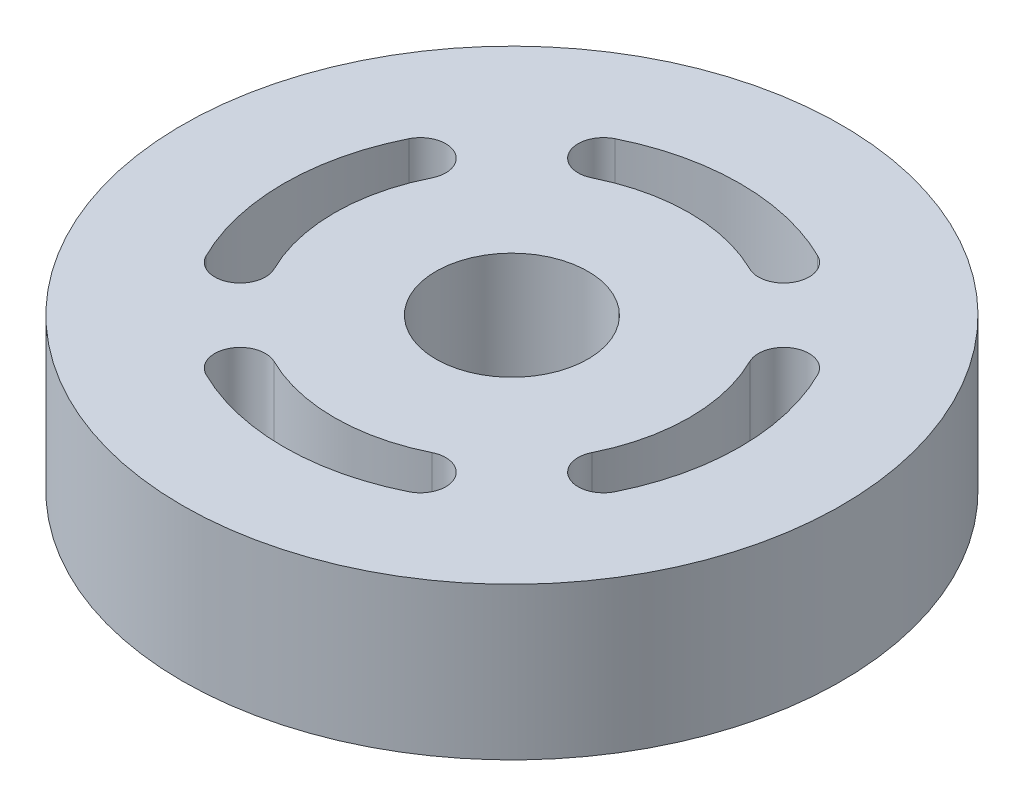
ISO-10303-21;
HEADER;
FILE_DESCRIPTION(('STEP AP214'),'2;1');
FILE_NAME('part.step','',(''),(''),'','','');
FILE_SCHEMA(('AUTOMOTIVE_DESIGN { 1 0 10303 214 1 1 1 1 }'));
ENDSEC;
DATA;
#1=APPLICATION_CONTEXT('core data for automotive mechanical design processes');
#2=APPLICATION_PROTOCOL_DEFINITION('international standard','automotive_design',2000,#1);
#3=PRODUCT_CONTEXT('',#1,'mechanical');
#4=PRODUCT('Part','Part','',(#3));
#5=PRODUCT_RELATED_PRODUCT_CATEGORY('part','',(#4));
#6=PRODUCT_DEFINITION_FORMATION('','',#4);
#7=PRODUCT_DEFINITION_CONTEXT('part definition',#1,'design');
#8=PRODUCT_DEFINITION('design','',#6,#7);
#9=PRODUCT_DEFINITION_SHAPE('','',#8);
#10=(LENGTH_UNIT() NAMED_UNIT(*) SI_UNIT(.MILLI.,.METRE.));
#11=(NAMED_UNIT(*) PLANE_ANGLE_UNIT() SI_UNIT($,.RADIAN.));
#12=(NAMED_UNIT(*) SI_UNIT($,.STERADIAN.) SOLID_ANGLE_UNIT());
#13=UNCERTAINTY_MEASURE_WITH_UNIT(LENGTH_MEASURE(1.E-05),#10,'distance_accuracy_value','');
#14=(GEOMETRIC_REPRESENTATION_CONTEXT(3) GLOBAL_UNCERTAINTY_ASSIGNED_CONTEXT((#13)) GLOBAL_UNIT_ASSIGNED_CONTEXT((#10,
#11,#12)) REPRESENTATION_CONTEXT('',''));
#15=CARTESIAN_POINT('',(0.,0.,0.));
#16=DIRECTION('',(0.,0.,1.));
#17=DIRECTION('',(1.,0.,0.));
#18=AXIS2_PLACEMENT_3D('',#15,#16,#17);
#19=CARTESIAN_POINT('',(7.1664513318209,6.,-3.55555555555563));
#20=DIRECTION('',(0.,-1.,0.));
#21=DIRECTION('',(1.,0.,0.));
#22=AXIS2_PLACEMENT_3D('',#19,#20,#21);
#23=CYLINDRICAL_SURFACE('',#22,1.);
#24=CARTESIAN_POINT('',(7.1664513318209,0.,-3.55555555555563));
#25=DIRECTION('',(0.,1.,0.));
#26=DIRECTION('',(1.,0.,0.));
#27=AXIS2_PLACEMENT_3D('',#24,#25,#26);
#28=CIRCLE('',#27,1.);
#29=CARTESIAN_POINT('',(8.06225774829851,0.,-4.00000000000008));
#30=VERTEX_POINT('',#29);
#31=CARTESIAN_POINT('',(6.27064491534328,0.,-3.11111111111118));
#32=VERTEX_POINT('',#31);
#33=EDGE_CURVE('E40',#30,#32,#28,.T.);
#34=ORIENTED_EDGE('',*,*,#33,.F.);
#35=DIRECTION('',(0.,-1.,0.));
#36=VECTOR('',#35,1.);
#37=CARTESIAN_POINT('',(8.06225774829851,6.,-4.00000000000008));
#38=LINE('',#37,#36);
#39=CARTESIAN_POINT('',(8.06225774829851,6.,-4.00000000000008));
#40=VERTEX_POINT('',#39);
#41=EDGE_CURVE('E269',#40,#30,#38,.T.);
#42=ORIENTED_EDGE('',*,*,#41,.F.);
#43=CARTESIAN_POINT('',(7.1664513318209,6.,-3.55555555555563));
#44=DIRECTION('',(0.,1.,0.));
#45=DIRECTION('',(1.,0.,0.));
#46=AXIS2_PLACEMENT_3D('',#43,#44,#45);
#47=CIRCLE('',#46,1.);
#48=CARTESIAN_POINT('',(6.27064491534328,6.,-3.11111111111118));
#49=VERTEX_POINT('',#48);
#50=EDGE_CURVE('E11',#40,#49,#47,.T.);
#51=ORIENTED_EDGE('',*,*,#50,.T.);
#52=DIRECTION('',(0.,-1.,0.));
#53=VECTOR('',#52,1.);
#54=CARTESIAN_POINT('',(6.27064491534328,6.,-3.11111111111118));
#55=LINE('',#54,#53);
#56=EDGE_CURVE('E273',#49,#32,#55,.T.);
#57=ORIENTED_EDGE('',*,*,#56,.T.);
#58=EDGE_LOOP('',(#34,#42,#51,#57));
#59=FACE_BOUND('',#58,.T.);
#60=ADVANCED_FACE('F33',(#59),#23,.F.);
#61=CARTESIAN_POINT('',(7.16645133182097,6.,3.55555555555548));
#62=DIRECTION('',(0.,-1.,0.));
#63=DIRECTION('',(1.,0.,0.));
#64=AXIS2_PLACEMENT_3D('',#61,#62,#63);
#65=CYLINDRICAL_SURFACE('',#64,1.);
#66=CARTESIAN_POINT('',(7.16645133182097,0.,3.55555555555548));
#67=DIRECTION('',(0.,1.,0.));
#68=DIRECTION('',(-1.,0.,0.));
#69=AXIS2_PLACEMENT_3D('',#66,#67,#68);
#70=CIRCLE('',#69,1.);
#71=CARTESIAN_POINT('',(6.27064491534335,0.,3.11111111111105));
#72=VERTEX_POINT('',#71);
#73=CARTESIAN_POINT('',(8.06225774829859,0.,3.99999999999992));
#74=VERTEX_POINT('',#73);
#75=EDGE_CURVE('E279',#72,#74,#70,.T.);
#76=ORIENTED_EDGE('',*,*,#75,.F.);
#77=DIRECTION('',(0.,-1.,0.));
#78=VECTOR('',#77,1.);
#79=CARTESIAN_POINT('',(6.27064491534335,6.,3.11111111111105));
#80=LINE('',#79,#78);
#81=CARTESIAN_POINT('',(6.27064491534335,6.,3.11111111111105));
#82=VERTEX_POINT('',#81);
#83=EDGE_CURVE('E277',#82,#72,#80,.T.);
#84=ORIENTED_EDGE('',*,*,#83,.F.);
#85=CARTESIAN_POINT('',(7.16645133182097,6.,3.55555555555548));
#86=DIRECTION('',(0.,1.,0.));
#87=DIRECTION('',(-1.,0.,0.));
#88=AXIS2_PLACEMENT_3D('',#85,#86,#87);
#89=CIRCLE('',#88,1.);
#90=CARTESIAN_POINT('',(8.06225774829859,6.,3.99999999999992));
#91=VERTEX_POINT('',#90);
#92=EDGE_CURVE('E281',#82,#91,#89,.T.);
#93=ORIENTED_EDGE('',*,*,#92,.T.);
#94=DIRECTION('',(0.,-1.,0.));
#95=VECTOR('',#94,1.);
#96=CARTESIAN_POINT('',(8.06225774829859,6.,3.99999999999992));
#97=LINE('',#96,#95);
#98=EDGE_CURVE('E264',#91,#74,#97,.T.);
#99=ORIENTED_EDGE('',*,*,#98,.T.);
#100=EDGE_LOOP('',(#76,#84,#93,#99));
#101=FACE_BOUND('',#100,.T.);
#102=ADVANCED_FACE('F296',(#101),#65,.F.);
#103=CARTESIAN_POINT('',(0.,6.,0.));
#104=DIRECTION('',(0.,-1.,0.));
#105=DIRECTION('',(1.,0.,0.));
#106=AXIS2_PLACEMENT_3D('',#103,#104,#105);
#107=CYLINDRICAL_SURFACE('',#106,7.);
#108=CARTESIAN_POINT('',(0.,0.,0.));
#109=DIRECTION('',(0.,-1.,0.));
#110=DIRECTION('',(-1.,0.,0.));
#111=AXIS2_PLACEMENT_3D('',#108,#109,#110);
#112=CIRCLE('',#111,7.);
#113=EDGE_CURVE('E47',#32,#72,#112,.T.);
#114=ORIENTED_EDGE('',*,*,#113,.F.);
#115=ORIENTED_EDGE('',*,*,#56,.F.);
#116=CARTESIAN_POINT('',(0.,6.,0.));
#117=DIRECTION('',(0.,-1.,0.));
#118=DIRECTION('',(1.,0.,0.));
#119=AXIS2_PLACEMENT_3D('',#116,#117,#118);
#120=CIRCLE('',#119,7.);
#121=EDGE_CURVE('E54',#49,#82,#120,.T.);
#122=ORIENTED_EDGE('',*,*,#121,.T.);
#123=ORIENTED_EDGE('',*,*,#83,.T.);
#124=EDGE_LOOP('',(#114,#115,#122,#123));
#125=FACE_BOUND('',#124,.T.);
#126=ADVANCED_FACE('F289',(#125),#107,.T.);
#127=CARTESIAN_POINT('',(0.,6.,0.));
#128=DIRECTION('',(0.,-1.,0.));
#129=DIRECTION('',(1.,0.,0.));
#130=AXIS2_PLACEMENT_3D('',#127,#128,#129);
#131=CYLINDRICAL_SURFACE('',#130,9.);
#132=CARTESIAN_POINT('',(0.,0.,0.));
#133=DIRECTION('',(0.,1.,0.));
#134=DIRECTION('',(1.,0.,0.));
#135=AXIS2_PLACEMENT_3D('',#132,#133,#134);
#136=CIRCLE('',#135,9.);
#137=EDGE_CURVE('E262',#74,#30,#136,.T.);
#138=ORIENTED_EDGE('',*,*,#137,.F.);
#139=ORIENTED_EDGE('',*,*,#98,.F.);
#140=CARTESIAN_POINT('',(0.,6.,0.));
#141=DIRECTION('',(0.,1.,0.));
#142=DIRECTION('',(-1.,0.,0.));
#143=AXIS2_PLACEMENT_3D('',#140,#141,#142);
#144=CIRCLE('',#143,9.);
#145=EDGE_CURVE('E267',#91,#40,#144,.T.);
#146=ORIENTED_EDGE('',*,*,#145,.T.);
#147=ORIENTED_EDGE('',*,*,#41,.T.);
#148=EDGE_LOOP('',(#138,#139,#146,#147));
#149=FACE_BOUND('',#148,.T.);
#150=ADVANCED_FACE('F298',(#149),#131,.F.);
#151=CARTESIAN_POINT('',(3.55555555555556,6.,7.16645133182093));
#152=DIRECTION('',(0.,-1.,0.));
#153=DIRECTION('',(0.,0.,1.));
#154=AXIS2_PLACEMENT_3D('',#151,#152,#153);
#155=CYLINDRICAL_SURFACE('',#154,1.);
#156=CARTESIAN_POINT('',(3.55555555555556,0.,7.16645133182093));
#157=DIRECTION('',(0.,1.,0.));
#158=DIRECTION('',(0.,0.,1.));
#159=AXIS2_PLACEMENT_3D('',#156,#157,#158);
#160=CIRCLE('',#159,1.);
#161=CARTESIAN_POINT('',(4.,0.,8.06225774829855));
#162=VERTEX_POINT('',#161);
#163=CARTESIAN_POINT('',(3.11111111111112,0.,6.27064491534332));
#164=VERTEX_POINT('',#163);
#165=EDGE_CURVE('E256',#162,#164,#160,.T.);
#166=ORIENTED_EDGE('',*,*,#165,.F.);
#167=DIRECTION('',(0.,-1.,0.));
#168=VECTOR('',#167,1.);
#169=CARTESIAN_POINT('',(4.,6.,8.06225774829855));
#170=LINE('',#169,#168);
#171=CARTESIAN_POINT('',(4.,6.,8.06225774829855));
#172=VERTEX_POINT('',#171);
#173=EDGE_CURVE('E237',#172,#162,#170,.T.);
#174=ORIENTED_EDGE('',*,*,#173,.F.);
#175=CARTESIAN_POINT('',(3.55555555555556,6.,7.16645133182093));
#176=DIRECTION('',(0.,1.,0.));
#177=DIRECTION('',(0.,0.,1.));
#178=AXIS2_PLACEMENT_3D('',#175,#176,#177);
#179=CIRCLE('',#178,1.);
#180=CARTESIAN_POINT('',(3.11111111111112,6.,6.27064491534332));
#181=VERTEX_POINT('',#180);
#182=EDGE_CURVE('E259',#172,#181,#179,.T.);
#183=ORIENTED_EDGE('',*,*,#182,.T.);
#184=DIRECTION('',(0.,-1.,0.));
#185=VECTOR('',#184,1.);
#186=CARTESIAN_POINT('',(3.11111111111112,6.,6.27064491534332));
#187=LINE('',#186,#185);
#188=EDGE_CURVE('E242',#181,#164,#187,.T.);
#189=ORIENTED_EDGE('',*,*,#188,.T.);
#190=EDGE_LOOP('',(#166,#174,#183,#189));
#191=FACE_BOUND('',#190,.T.);
#192=ADVANCED_FACE('F300',(#191),#155,.F.);
#193=CARTESIAN_POINT('',(-3.55555555555556,6.,7.16645133182093));
#194=DIRECTION('',(0.,-1.,0.));
#195=DIRECTION('',(0.,0.,1.));
#196=AXIS2_PLACEMENT_3D('',#193,#194,#195);
#197=CYLINDRICAL_SURFACE('',#196,1.);
#198=CARTESIAN_POINT('',(-3.55555555555556,0.,7.16645133182093));
#199=DIRECTION('',(0.,1.,0.));
#200=DIRECTION('',(0.,0.,-1.));
#201=AXIS2_PLACEMENT_3D('',#198,#199,#200);
#202=CIRCLE('',#201,1.);
#203=CARTESIAN_POINT('',(-3.11111111111111,0.,6.27064491534332));
#204=VERTEX_POINT('',#203);
#205=CARTESIAN_POINT('',(-4.,0.,8.06225774829855));
#206=VERTEX_POINT('',#205);
#207=EDGE_CURVE('E250',#204,#206,#202,.T.);
#208=ORIENTED_EDGE('',*,*,#207,.F.);
#209=DIRECTION('',(0.,-1.,0.));
#210=VECTOR('',#209,1.);
#211=CARTESIAN_POINT('',(-3.11111111111111,6.,6.27064491534332));
#212=LINE('',#211,#210);
#213=CARTESIAN_POINT('',(-3.11111111111111,6.,6.27064491534332));
#214=VERTEX_POINT('',#213);
#215=EDGE_CURVE('E247',#214,#204,#212,.T.);
#216=ORIENTED_EDGE('',*,*,#215,.F.);
#217=CARTESIAN_POINT('',(-3.55555555555556,6.,7.16645133182093));
#218=DIRECTION('',(0.,1.,0.));
#219=DIRECTION('',(0.,0.,-1.));
#220=AXIS2_PLACEMENT_3D('',#217,#218,#219);
#221=CIRCLE('',#220,1.);
#222=CARTESIAN_POINT('',(-4.,6.,8.06225774829855));
#223=VERTEX_POINT('',#222);
#224=EDGE_CURVE('E253',#214,#223,#221,.T.);
#225=ORIENTED_EDGE('',*,*,#224,.T.);
#226=DIRECTION('',(0.,-1.,0.));
#227=VECTOR('',#226,1.);
#228=CARTESIAN_POINT('',(-4.,6.,8.06225774829855));
#229=LINE('',#228,#227);
#230=EDGE_CURVE('E232',#223,#206,#229,.T.);
#231=ORIENTED_EDGE('',*,*,#230,.T.);
#232=EDGE_LOOP('',(#208,#216,#225,#231));
#233=FACE_BOUND('',#232,.T.);
#234=ADVANCED_FACE('F306',(#233),#197,.F.);
#235=CARTESIAN_POINT('',(0.,6.,0.));
#236=DIRECTION('',(0.,-1.,0.));
#237=DIRECTION('',(0.,0.,1.));
#238=AXIS2_PLACEMENT_3D('',#235,#236,#237);
#239=CYLINDRICAL_SURFACE('',#238,7.);
#240=CARTESIAN_POINT('',(0.,0.,0.));
#241=DIRECTION('',(0.,-1.,0.));
#242=DIRECTION('',(0.,0.,-1.));
#243=AXIS2_PLACEMENT_3D('',#240,#241,#242);
#244=CIRCLE('',#243,7.);
#245=EDGE_CURVE('E240',#164,#204,#244,.T.);
#246=ORIENTED_EDGE('',*,*,#245,.F.);
#247=ORIENTED_EDGE('',*,*,#188,.F.);
#248=CARTESIAN_POINT('',(0.,6.,0.));
#249=DIRECTION('',(0.,-1.,0.));
#250=DIRECTION('',(0.,0.,1.));
#251=AXIS2_PLACEMENT_3D('',#248,#249,#250);
#252=CIRCLE('',#251,7.);
#253=EDGE_CURVE('E245',#181,#214,#252,.T.);
#254=ORIENTED_EDGE('',*,*,#253,.T.);
#255=ORIENTED_EDGE('',*,*,#215,.T.);
#256=EDGE_LOOP('',(#246,#247,#254,#255));
#257=FACE_BOUND('',#256,.T.);
#258=ADVANCED_FACE('F341',(#257),#239,.T.);
#259=CARTESIAN_POINT('',(0.,6.,0.));
#260=DIRECTION('',(0.,-1.,0.));
#261=DIRECTION('',(0.,0.,1.));
#262=AXIS2_PLACEMENT_3D('',#259,#260,#261);
#263=CYLINDRICAL_SURFACE('',#262,9.);
#264=CARTESIAN_POINT('',(0.,0.,0.));
#265=DIRECTION('',(0.,1.,0.));
#266=DIRECTION('',(0.,0.,1.));
#267=AXIS2_PLACEMENT_3D('',#264,#265,#266);
#268=CIRCLE('',#267,9.);
#269=EDGE_CURVE('E230',#206,#162,#268,.T.);
#270=ORIENTED_EDGE('',*,*,#269,.F.);
#271=ORIENTED_EDGE('',*,*,#230,.F.);
#272=CARTESIAN_POINT('',(0.,6.,0.));
#273=DIRECTION('',(0.,1.,0.));
#274=DIRECTION('',(0.,0.,-1.));
#275=AXIS2_PLACEMENT_3D('',#272,#273,#274);
#276=CIRCLE('',#275,9.);
#277=EDGE_CURVE('E235',#223,#172,#276,.T.);
#278=ORIENTED_EDGE('',*,*,#277,.T.);
#279=ORIENTED_EDGE('',*,*,#173,.T.);
#280=EDGE_LOOP('',(#270,#271,#278,#279));
#281=FACE_BOUND('',#280,.T.);
#282=ADVANCED_FACE('F352',(#281),#263,.F.);
#283=CARTESIAN_POINT('',(-7.16645133182092,6.,3.55555555555558));
#284=DIRECTION('',(0.,-1.,0.));
#285=DIRECTION('',(-1.,0.,0.));
#286=AXIS2_PLACEMENT_3D('',#283,#284,#285);
#287=CYLINDRICAL_SURFACE('',#286,1.);
#288=CARTESIAN_POINT('',(-7.16645133182092,0.,3.55555555555558));
#289=DIRECTION('',(0.,1.,0.));
#290=DIRECTION('',(-1.,0.,0.));
#291=AXIS2_PLACEMENT_3D('',#288,#289,#290);
#292=CIRCLE('',#291,1.);
#293=CARTESIAN_POINT('',(-8.06225774829854,0.,4.00000000000003));
#294=VERTEX_POINT('',#293);
#295=CARTESIAN_POINT('',(-6.2706449153433,0.,3.11111111111114));
#296=VERTEX_POINT('',#295);
#297=EDGE_CURVE('E224',#294,#296,#292,.T.);
#298=ORIENTED_EDGE('',*,*,#297,.F.);
#299=DIRECTION('',(0.,-1.,0.));
#300=VECTOR('',#299,1.);
#301=CARTESIAN_POINT('',(-8.06225774829854,6.,4.00000000000003));
#302=LINE('',#301,#300);
#303=CARTESIAN_POINT('',(-8.06225774829854,6.,4.00000000000003));
#304=VERTEX_POINT('',#303);
#305=EDGE_CURVE('E205',#304,#294,#302,.T.);
#306=ORIENTED_EDGE('',*,*,#305,.F.);
#307=CARTESIAN_POINT('',(-7.16645133182092,6.,3.55555555555558));
#308=DIRECTION('',(0.,1.,0.));
#309=DIRECTION('',(-1.,0.,0.));
#310=AXIS2_PLACEMENT_3D('',#307,#308,#309);
#311=CIRCLE('',#310,1.);
#312=CARTESIAN_POINT('',(-6.2706449153433,6.,3.11111111111114));
#313=VERTEX_POINT('',#312);
#314=EDGE_CURVE('E227',#304,#313,#311,.T.);
#315=ORIENTED_EDGE('',*,*,#314,.T.);
#316=DIRECTION('',(0.,-1.,0.));
#317=VECTOR('',#316,1.);
#318=CARTESIAN_POINT('',(-6.2706449153433,6.,3.11111111111114));
#319=LINE('',#318,#317);
#320=EDGE_CURVE('E210',#313,#296,#319,.T.);
#321=ORIENTED_EDGE('',*,*,#320,.T.);
#322=EDGE_LOOP('',(#298,#306,#315,#321));
#323=FACE_BOUND('',#322,.T.);
#324=ADVANCED_FACE('F363',(#323),#287,.F.);
#325=CARTESIAN_POINT('',(-7.16645133182095,6.,-3.55555555555553));
#326=DIRECTION('',(0.,-1.,0.));
#327=DIRECTION('',(-1.,0.,0.));
#328=AXIS2_PLACEMENT_3D('',#325,#326,#327);
#329=CYLINDRICAL_SURFACE('',#328,1.);
#330=CARTESIAN_POINT('',(-7.16645133182095,0.,-3.55555555555553));
#331=DIRECTION('',(0.,1.,0.));
#332=DIRECTION('',(1.,0.,0.));
#333=AXIS2_PLACEMENT_3D('',#330,#331,#332);
#334=CIRCLE('',#333,1.);
#335=CARTESIAN_POINT('',(-6.27064491534333,0.,-3.11111111111109));
#336=VERTEX_POINT('',#335);
#337=CARTESIAN_POINT('',(-8.06225774829857,0.,-3.99999999999997));
#338=VERTEX_POINT('',#337);
#339=EDGE_CURVE('E218',#336,#338,#334,.T.);
#340=ORIENTED_EDGE('',*,*,#339,.F.);
#341=DIRECTION('',(0.,-1.,0.));
#342=VECTOR('',#341,1.);
#343=CARTESIAN_POINT('',(-6.27064491534333,6.,-3.11111111111109));
#344=LINE('',#343,#342);
#345=CARTESIAN_POINT('',(-6.27064491534333,6.,-3.11111111111109));
#346=VERTEX_POINT('',#345);
#347=EDGE_CURVE('E215',#346,#336,#344,.T.);
#348=ORIENTED_EDGE('',*,*,#347,.F.);
#349=CARTESIAN_POINT('',(-7.16645133182095,6.,-3.55555555555553));
#350=DIRECTION('',(0.,1.,0.));
#351=DIRECTION('',(1.,0.,0.));
#352=AXIS2_PLACEMENT_3D('',#349,#350,#351);
#353=CIRCLE('',#352,1.);
#354=CARTESIAN_POINT('',(-8.06225774829857,6.,-3.99999999999997));
#355=VERTEX_POINT('',#354);
#356=EDGE_CURVE('E221',#346,#355,#353,.T.);
#357=ORIENTED_EDGE('',*,*,#356,.T.);
#358=DIRECTION('',(0.,-1.,0.));
#359=VECTOR('',#358,1.);
#360=CARTESIAN_POINT('',(-8.06225774829857,6.,-3.99999999999997));
#361=LINE('',#360,#359);
#362=EDGE_CURVE('E200',#355,#338,#361,.T.);
#363=ORIENTED_EDGE('',*,*,#362,.T.);
#364=EDGE_LOOP('',(#340,#348,#357,#363));
#365=FACE_BOUND('',#364,.T.);
#366=ADVANCED_FACE('F373',(#365),#329,.F.);
#367=CARTESIAN_POINT('',(0.,6.,0.));
#368=DIRECTION('',(0.,-1.,0.));
#369=DIRECTION('',(-1.,0.,0.));
#370=AXIS2_PLACEMENT_3D('',#367,#368,#369);
#371=CYLINDRICAL_SURFACE('',#370,7.);
#372=CARTESIAN_POINT('',(0.,0.,0.));
#373=DIRECTION('',(0.,-1.,0.));
#374=DIRECTION('',(1.,0.,0.));
#375=AXIS2_PLACEMENT_3D('',#372,#373,#374);
#376=CIRCLE('',#375,7.);
#377=EDGE_CURVE('E208',#296,#336,#376,.T.);
#378=ORIENTED_EDGE('',*,*,#377,.F.);
#379=ORIENTED_EDGE('',*,*,#320,.F.);
#380=CARTESIAN_POINT('',(0.,6.,0.));
#381=DIRECTION('',(0.,-1.,0.));
#382=DIRECTION('',(-1.,0.,0.));
#383=AXIS2_PLACEMENT_3D('',#380,#381,#382);
#384=CIRCLE('',#383,7.);
#385=EDGE_CURVE('E213',#313,#346,#384,.T.);
#386=ORIENTED_EDGE('',*,*,#385,.T.);
#387=ORIENTED_EDGE('',*,*,#347,.T.);
#388=EDGE_LOOP('',(#378,#379,#386,#387));
#389=FACE_BOUND('',#388,.T.);
#390=ADVANCED_FACE('F383',(#389),#371,.T.);
#391=CARTESIAN_POINT('',(0.,6.,0.));
#392=DIRECTION('',(0.,-1.,0.));
#393=DIRECTION('',(-1.,0.,0.));
#394=AXIS2_PLACEMENT_3D('',#391,#392,#393);
#395=CYLINDRICAL_SURFACE('',#394,9.);
#396=CARTESIAN_POINT('',(0.,0.,0.));
#397=DIRECTION('',(0.,1.,0.));
#398=DIRECTION('',(-1.,0.,0.));
#399=AXIS2_PLACEMENT_3D('',#396,#397,#398);
#400=CIRCLE('',#399,9.);
#401=EDGE_CURVE('E196',#338,#294,#400,.T.);
#402=ORIENTED_EDGE('',*,*,#401,.F.);
#403=ORIENTED_EDGE('',*,*,#362,.F.);
#404=CARTESIAN_POINT('',(0.,6.,0.));
#405=DIRECTION('',(0.,1.,0.));
#406=DIRECTION('',(1.,0.,0.));
#407=AXIS2_PLACEMENT_3D('',#404,#405,#406);
#408=CIRCLE('',#407,9.);
#409=EDGE_CURVE('E203',#355,#304,#408,.T.);
#410=ORIENTED_EDGE('',*,*,#409,.T.);
#411=ORIENTED_EDGE('',*,*,#305,.T.);
#412=EDGE_LOOP('',(#402,#403,#410,#411));
#413=FACE_BOUND('',#412,.T.);
#414=ADVANCED_FACE('F394',(#413),#395,.F.);
#415=CARTESIAN_POINT('',(0.,6.,0.));
#416=DIRECTION('',(0.,1.,0.));
#417=DIRECTION('',(0.,0.,1.));
#418=AXIS2_PLACEMENT_3D('',#415,#416,#417);
#419=PLANE('',#418);
#420=ORIENTED_EDGE('',*,*,#121,.F.);
#421=ORIENTED_EDGE('',*,*,#50,.F.);
#422=ORIENTED_EDGE('',*,*,#145,.F.);
#423=ORIENTED_EDGE('',*,*,#92,.F.);
#424=EDGE_LOOP('',(#420,#421,#422,#423));
#425=FACE_BOUND('',#424,.T.);
#426=ORIENTED_EDGE('',*,*,#253,.F.);
#427=ORIENTED_EDGE('',*,*,#182,.F.);
#428=ORIENTED_EDGE('',*,*,#277,.F.);
#429=ORIENTED_EDGE('',*,*,#224,.F.);
#430=EDGE_LOOP('',(#426,#427,#428,#429));
#431=FACE_BOUND('',#430,.T.);
#432=ORIENTED_EDGE('',*,*,#385,.F.);
#433=ORIENTED_EDGE('',*,*,#314,.F.);
#434=ORIENTED_EDGE('',*,*,#409,.F.);
#435=ORIENTED_EDGE('',*,*,#356,.F.);
#436=EDGE_LOOP('',(#432,#433,#434,#435));
#437=FACE_BOUND('',#436,.T.);
#438=CARTESIAN_POINT('',(0.,6.,0.));
#439=DIRECTION('',(0.,-1.,0.));
#440=DIRECTION('',(0.,0.,-1.));
#441=AXIS2_PLACEMENT_3D('',#438,#439,#440);
#442=CIRCLE('',#441,7.);
#443=CARTESIAN_POINT('',(-3.11111111111112,6.,-6.27064491534332));
#444=VERTEX_POINT('',#443);
#445=CARTESIAN_POINT('',(3.11111111111111,6.,-6.27064491534332));
#446=VERTEX_POINT('',#445);
#447=EDGE_CURVE('E157',#444,#446,#442,.T.);
#448=ORIENTED_EDGE('',*,*,#447,.F.);
#449=CARTESIAN_POINT('',(-3.55555555555556,6.,-7.16645133182093));
#450=DIRECTION('',(0.,1.,0.));
#451=DIRECTION('',(0.,0.,-1.));
#452=AXIS2_PLACEMENT_3D('',#449,#450,#451);
#453=CIRCLE('',#452,1.);
#454=CARTESIAN_POINT('',(-4.,6.,-8.06225774829855));
#455=VERTEX_POINT('',#454);
#456=EDGE_CURVE('E147',#455,#444,#453,.T.);
#457=ORIENTED_EDGE('',*,*,#456,.F.);
#458=CARTESIAN_POINT('',(0.,6.,0.));
#459=DIRECTION('',(0.,1.,0.));
#460=DIRECTION('',(0.,0.,1.));
#461=AXIS2_PLACEMENT_3D('',#458,#459,#460);
#462=CIRCLE('',#461,9.);
#463=CARTESIAN_POINT('',(4.,6.,-8.06225774829855));
#464=VERTEX_POINT('',#463);
#465=EDGE_CURVE('E174',#464,#455,#462,.T.);
#466=ORIENTED_EDGE('',*,*,#465,.F.);
#467=CARTESIAN_POINT('',(3.55555555555556,6.,-7.16645133182093));
#468=DIRECTION('',(0.,1.,0.));
#469=DIRECTION('',(0.,0.,1.));
#470=AXIS2_PLACEMENT_3D('',#467,#468,#469);
#471=CIRCLE('',#470,1.);
#472=EDGE_CURVE('E172',#446,#464,#471,.T.);
#473=ORIENTED_EDGE('',*,*,#472,.F.);
#474=EDGE_LOOP('',(#448,#457,#466,#473));
#475=FACE_BOUND('',#474,.T.);
#476=CARTESIAN_POINT('',(0.,6.,0.));
#477=DIRECTION('',(0.,1.,0.));
#478=DIRECTION('',(0.,0.,1.));
#479=AXIS2_PLACEMENT_3D('',#476,#477,#478);
#480=CIRCLE('',#479,13.);
#481=CARTESIAN_POINT('',(0.,6.,13.));
#482=VERTEX_POINT('',#481);
#483=EDGE_CURVE('E193',#482,#482,#480,.T.);
#484=ORIENTED_EDGE('',*,*,#483,.T.);
#485=EDGE_LOOP('',(#484));
#486=FACE_BOUND('',#485,.T.);
#487=CARTESIAN_POINT('',(0.,6.,0.));
#488=DIRECTION('',(0.,1.,0.));
#489=DIRECTION('',(0.,0.,1.));
#490=AXIS2_PLACEMENT_3D('',#487,#488,#489);
#491=CIRCLE('',#490,3.);
#492=CARTESIAN_POINT('',(0.,6.,3.));
#493=VERTEX_POINT('',#492);
#494=EDGE_CURVE('E181',#493,#493,#491,.T.);
#495=ORIENTED_EDGE('',*,*,#494,.F.);
#496=EDGE_LOOP('',(#495));
#497=FACE_BOUND('',#496,.T.);
#498=ADVANCED_FACE('F169',(#425,#431,#437,#475,#486,#497),#419,.T.);
#499=CARTESIAN_POINT('',(0.,0.,0.));
#500=DIRECTION('',(0.,1.,0.));
#501=DIRECTION('',(0.,0.,1.));
#502=AXIS2_PLACEMENT_3D('',#499,#500,#501);
#503=PLANE('',#502);
#504=ORIENTED_EDGE('',*,*,#33,.T.);
#505=ORIENTED_EDGE('',*,*,#113,.T.);
#506=ORIENTED_EDGE('',*,*,#75,.T.);
#507=ORIENTED_EDGE('',*,*,#137,.T.);
#508=EDGE_LOOP('',(#504,#505,#506,#507));
#509=FACE_BOUND('',#508,.T.);
#510=ORIENTED_EDGE('',*,*,#165,.T.);
#511=ORIENTED_EDGE('',*,*,#245,.T.);
#512=ORIENTED_EDGE('',*,*,#207,.T.);
#513=ORIENTED_EDGE('',*,*,#269,.T.);
#514=EDGE_LOOP('',(#510,#511,#512,#513));
#515=FACE_BOUND('',#514,.T.);
#516=ORIENTED_EDGE('',*,*,#297,.T.);
#517=ORIENTED_EDGE('',*,*,#377,.T.);
#518=ORIENTED_EDGE('',*,*,#339,.T.);
#519=ORIENTED_EDGE('',*,*,#401,.T.);
#520=EDGE_LOOP('',(#516,#517,#518,#519));
#521=FACE_BOUND('',#520,.T.);
#522=CARTESIAN_POINT('',(0.,0.,0.));
#523=DIRECTION('',(0.,1.,0.));
#524=DIRECTION('',(0.,0.,1.));
#525=AXIS2_PLACEMENT_3D('',#522,#523,#524);
#526=CIRCLE('',#525,13.);
#527=CARTESIAN_POINT('',(0.,0.,13.));
#528=VERTEX_POINT('',#527);
#529=EDGE_CURVE('E165',#528,#528,#526,.T.);
#530=ORIENTED_EDGE('',*,*,#529,.F.);
#531=EDGE_LOOP('',(#530));
#532=FACE_BOUND('',#531,.T.);
#533=CARTESIAN_POINT('',(-3.55555555555556,0.,-7.16645133182093));
#534=DIRECTION('',(0.,1.,0.));
#535=DIRECTION('',(0.,0.,-1.));
#536=AXIS2_PLACEMENT_3D('',#533,#534,#535);
#537=CIRCLE('',#536,1.);
#538=CARTESIAN_POINT('',(-4.,0.,-8.06225774829855));
#539=VERTEX_POINT('',#538);
#540=CARTESIAN_POINT('',(-3.11111111111112,0.,-6.27064491534332));
#541=VERTEX_POINT('',#540);
#542=EDGE_CURVE('E179',#539,#541,#537,.T.);
#543=ORIENTED_EDGE('',*,*,#542,.T.);
#544=CARTESIAN_POINT('',(0.,0.,0.));
#545=DIRECTION('',(0.,-1.,0.));
#546=DIRECTION('',(0.,0.,1.));
#547=AXIS2_PLACEMENT_3D('',#544,#545,#546);
#548=CIRCLE('',#547,7.);
#549=CARTESIAN_POINT('',(3.11111111111111,0.,-6.27064491534332));
#550=VERTEX_POINT('',#549);
#551=EDGE_CURVE('E164',#541,#550,#548,.T.);
#552=ORIENTED_EDGE('',*,*,#551,.T.);
#553=CARTESIAN_POINT('',(3.55555555555556,0.,-7.16645133182093));
#554=DIRECTION('',(0.,1.,0.));
#555=DIRECTION('',(0.,0.,1.));
#556=AXIS2_PLACEMENT_3D('',#553,#554,#555);
#557=CIRCLE('',#556,1.);
#558=CARTESIAN_POINT('',(4.,0.,-8.06225774829855));
#559=VERTEX_POINT('',#558);
#560=EDGE_CURVE('E183',#550,#559,#557,.T.);
#561=ORIENTED_EDGE('',*,*,#560,.T.);
#562=CARTESIAN_POINT('',(0.,0.,0.));
#563=DIRECTION('',(0.,1.,0.));
#564=DIRECTION('',(0.,0.,-1.));
#565=AXIS2_PLACEMENT_3D('',#562,#563,#564);
#566=CIRCLE('',#565,9.);
#567=EDGE_CURVE('E158',#559,#539,#566,.T.);
#568=ORIENTED_EDGE('',*,*,#567,.T.);
#569=EDGE_LOOP('',(#543,#552,#561,#568));
#570=FACE_BOUND('',#569,.T.);
#571=CARTESIAN_POINT('',(0.,0.,0.));
#572=DIRECTION('',(0.,1.,0.));
#573=DIRECTION('',(0.,0.,1.));
#574=AXIS2_PLACEMENT_3D('',#571,#572,#573);
#575=CIRCLE('',#574,3.);
#576=CARTESIAN_POINT('',(0.,0.,3.));
#577=VERTEX_POINT('',#576);
#578=EDGE_CURVE('E500',#577,#577,#575,.T.);
#579=ORIENTED_EDGE('',*,*,#578,.T.);
#580=EDGE_LOOP('',(#579));
#581=FACE_BOUND('',#580,.T.);
#582=ADVANCED_FACE('F284',(#509,#515,#521,#532,#570,#581),#503,.F.);
#583=CARTESIAN_POINT('',(0.,6.,0.));
#584=DIRECTION('',(0.,-1.,0.));
#585=DIRECTION('',(0.,0.,-1.));
#586=AXIS2_PLACEMENT_3D('',#583,#584,#585);
#587=CYLINDRICAL_SURFACE('',#586,13.);
#588=ORIENTED_EDGE('',*,*,#483,.F.);
#589=EDGE_LOOP('',(#588));
#590=FACE_BOUND('',#589,.T.);
#591=ORIENTED_EDGE('',*,*,#529,.T.);
#592=EDGE_LOOP('',(#591));
#593=FACE_BOUND('',#592,.T.);
#594=ADVANCED_FACE('F421',(#590,#593),#587,.T.);
#595=CARTESIAN_POINT('',(-3.55555555555556,6.,-7.16645133182093));
#596=DIRECTION('',(0.,-1.,0.));
#597=DIRECTION('',(0.,0.,-1.));
#598=AXIS2_PLACEMENT_3D('',#595,#596,#597);
#599=CYLINDRICAL_SURFACE('',#598,1.);
#600=ORIENTED_EDGE('',*,*,#542,.F.);
#601=DIRECTION('',(0.,-1.,0.));
#602=VECTOR('',#601,1.);
#603=CARTESIAN_POINT('',(-4.,6.,-8.06225774829855));
#604=LINE('',#603,#602);
#605=EDGE_CURVE('E153',#455,#539,#604,.T.);
#606=ORIENTED_EDGE('',*,*,#605,.F.);
#607=ORIENTED_EDGE('',*,*,#456,.T.);
#608=DIRECTION('',(0.,-1.,0.));
#609=VECTOR('',#608,1.);
#610=CARTESIAN_POINT('',(-3.11111111111112,6.,-6.27064491534332));
#611=LINE('',#610,#609);
#612=EDGE_CURVE('E150',#444,#541,#611,.T.);
#613=ORIENTED_EDGE('',*,*,#612,.T.);
#614=EDGE_LOOP('',(#600,#606,#607,#613));
#615=FACE_BOUND('',#614,.T.);
#616=ADVANCED_FACE('F149',(#615),#599,.F.);
#617=CARTESIAN_POINT('',(0.,6.,0.));
#618=DIRECTION('',(0.,-1.,0.));
#619=DIRECTION('',(0.,0.,-1.));
#620=AXIS2_PLACEMENT_3D('',#617,#618,#619);
#621=CYLINDRICAL_SURFACE('',#620,7.);
#622=ORIENTED_EDGE('',*,*,#551,.F.);
#623=ORIENTED_EDGE('',*,*,#612,.F.);
#624=ORIENTED_EDGE('',*,*,#447,.T.);
#625=DIRECTION('',(0.,-1.,0.));
#626=VECTOR('',#625,1.);
#627=CARTESIAN_POINT('',(3.11111111111111,6.,-6.27064491534332));
#628=LINE('',#627,#626);
#629=EDGE_CURVE('E166',#446,#550,#628,.T.);
#630=ORIENTED_EDGE('',*,*,#629,.T.);
#631=EDGE_LOOP('',(#622,#623,#624,#630));
#632=FACE_BOUND('',#631,.T.);
#633=ADVANCED_FACE('F161',(#632),#621,.T.);
#634=CARTESIAN_POINT('',(3.55555555555556,6.,-7.16645133182093));
#635=DIRECTION('',(0.,-1.,0.));
#636=DIRECTION('',(0.,0.,-1.));
#637=AXIS2_PLACEMENT_3D('',#634,#635,#636);
#638=CYLINDRICAL_SURFACE('',#637,1.);
#639=ORIENTED_EDGE('',*,*,#560,.F.);
#640=ORIENTED_EDGE('',*,*,#629,.F.);
#641=ORIENTED_EDGE('',*,*,#472,.T.);
#642=DIRECTION('',(0.,-1.,0.));
#643=VECTOR('',#642,1.);
#644=CARTESIAN_POINT('',(4.,6.,-8.06225774829855));
#645=LINE('',#644,#643);
#646=EDGE_CURVE('E189',#464,#559,#645,.T.);
#647=ORIENTED_EDGE('',*,*,#646,.T.);
#648=EDGE_LOOP('',(#639,#640,#641,#647));
#649=FACE_BOUND('',#648,.T.);
#650=ADVANCED_FACE('F443',(#649),#638,.F.);
#651=CARTESIAN_POINT('',(0.,6.,0.));
#652=DIRECTION('',(0.,-1.,0.));
#653=DIRECTION('',(0.,0.,-1.));
#654=AXIS2_PLACEMENT_3D('',#651,#652,#653);
#655=CYLINDRICAL_SURFACE('',#654,9.);
#656=ORIENTED_EDGE('',*,*,#567,.F.);
#657=ORIENTED_EDGE('',*,*,#646,.F.);
#658=ORIENTED_EDGE('',*,*,#465,.T.);
#659=ORIENTED_EDGE('',*,*,#605,.T.);
#660=EDGE_LOOP('',(#656,#657,#658,#659));
#661=FACE_BOUND('',#660,.T.);
#662=ADVANCED_FACE('F450',(#661),#655,.F.);
#663=CARTESIAN_POINT('',(0.,6.,0.));
#664=DIRECTION('',(0.,-1.,0.));
#665=DIRECTION('',(0.,0.,-1.));
#666=AXIS2_PLACEMENT_3D('',#663,#664,#665);
#667=CYLINDRICAL_SURFACE('',#666,3.);
#668=ORIENTED_EDGE('',*,*,#494,.T.);
#669=EDGE_LOOP('',(#668));
#670=FACE_BOUND('',#669,.T.);
#671=ORIENTED_EDGE('',*,*,#578,.F.);
#672=EDGE_LOOP('',(#671));
#673=FACE_BOUND('',#672,.T.);
#674=ADVANCED_FACE('F458',(#670,#673),#667,.F.);
#675=CLOSED_SHELL('',(#60,#102,#126,#150,#192,#234,#258,#282,#324,#366,#390,#414,#498,#582,#594,
#616,#633,#650,#662,#674));
#676=MANIFOLD_SOLID_BREP('B2',#675);
#677=ADVANCED_BREP_SHAPE_REPRESENTATION('',(#18,#676),#14);
#678=SHAPE_DEFINITION_REPRESENTATION(#9,#677);
ENDSEC;
END-ISO-10303-21;
